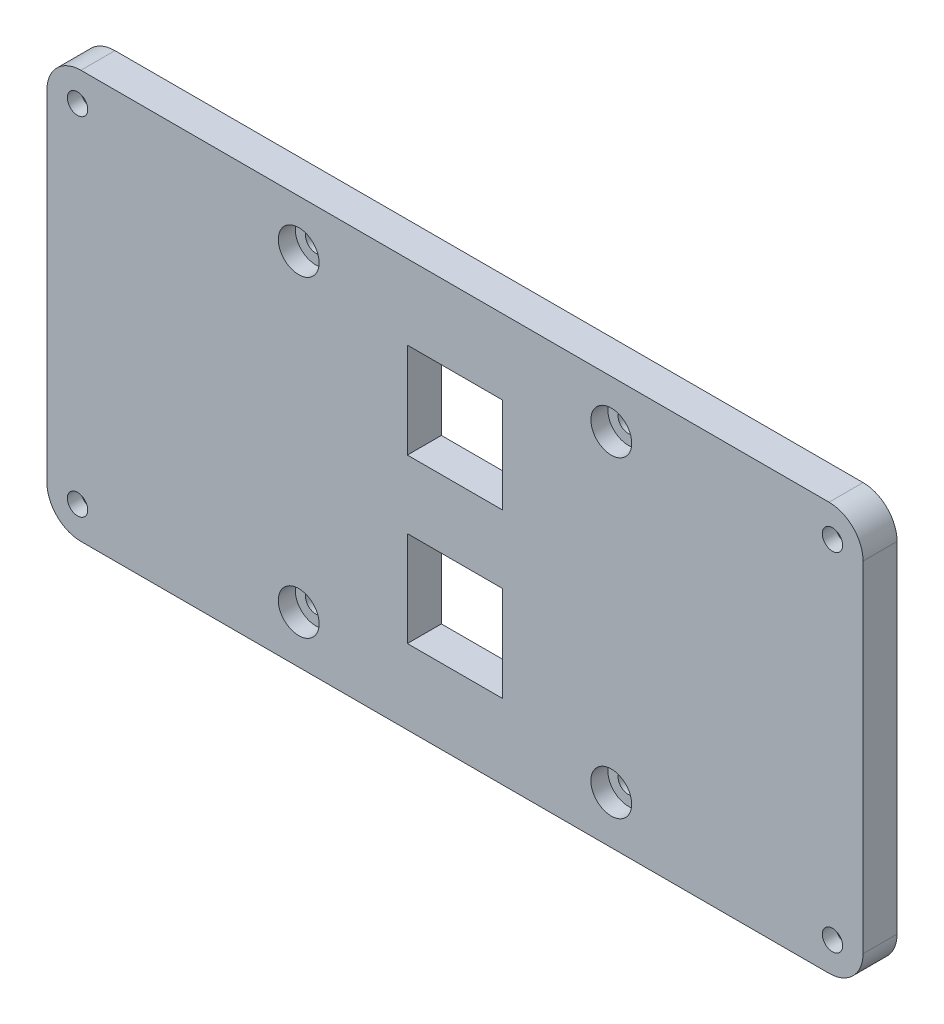
ISO-10303-21;
HEADER;
FILE_DESCRIPTION(('STEP AP214'),'2;1');
FILE_NAME('part.step','',(''),(''),'','','');
FILE_SCHEMA(('AUTOMOTIVE_DESIGN { 1 0 10303 214 1 1 1 1 }'));
ENDSEC;
DATA;
#1=APPLICATION_CONTEXT('core data for automotive mechanical design processes');
#2=APPLICATION_PROTOCOL_DEFINITION('international standard','automotive_design',2000,#1);
#3=PRODUCT_CONTEXT('',#1,'mechanical');
#4=PRODUCT('Part','Part','',(#3));
#5=PRODUCT_RELATED_PRODUCT_CATEGORY('part','',(#4));
#6=PRODUCT_DEFINITION_FORMATION('','',#4);
#7=PRODUCT_DEFINITION_CONTEXT('part definition',#1,'design');
#8=PRODUCT_DEFINITION('design','',#6,#7);
#9=PRODUCT_DEFINITION_SHAPE('','',#8);
#10=(LENGTH_UNIT() NAMED_UNIT(*) SI_UNIT(.MILLI.,.METRE.));
#11=(NAMED_UNIT(*) PLANE_ANGLE_UNIT() SI_UNIT($,.RADIAN.));
#12=(NAMED_UNIT(*) SI_UNIT($,.STERADIAN.) SOLID_ANGLE_UNIT());
#13=UNCERTAINTY_MEASURE_WITH_UNIT(LENGTH_MEASURE(1.E-05),#10,'distance_accuracy_value','');
#14=(GEOMETRIC_REPRESENTATION_CONTEXT(3) GLOBAL_UNCERTAINTY_ASSIGNED_CONTEXT((#13)) GLOBAL_UNIT_ASSIGNED_CONTEXT((#10,
#11,#12)) REPRESENTATION_CONTEXT('',''));
#15=CARTESIAN_POINT('',(0.,0.,0.));
#16=DIRECTION('',(0.,0.,1.));
#17=DIRECTION('',(1.,0.,0.));
#18=AXIS2_PLACEMENT_3D('',#15,#16,#17);
#19=CARTESIAN_POINT('',(0.,0.,0.));
#20=DIRECTION('',(0.,0.,1.));
#21=DIRECTION('',(1.,0.,0.));
#22=AXIS2_PLACEMENT_3D('',#19,#20,#21);
#23=PLANE('',#22);
#24=CARTESIAN_POINT('',(82.9809703885621,52.9809703885621,0.));
#25=DIRECTION('',(0.,0.,1.));
#26=DIRECTION('',(1.,0.,0.));
#27=AXIS2_PLACEMENT_3D('',#24,#25,#26);
#28=CIRCLE('',#27,1.50000000000023);
#29=CARTESIAN_POINT('',(84.4809703885623,52.9809703885621,0.));
#30=VERTEX_POINT('',#29);
#31=EDGE_CURVE('E157',#30,#30,#28,.T.);
#32=ORIENTED_EDGE('',*,*,#31,.T.);
#33=EDGE_LOOP('',(#32));
#34=FACE_BOUND('',#33,.T.);
#35=CARTESIAN_POINT('',(82.9809703885621,7.01902961143792,0.));
#36=DIRECTION('',(0.,0.,1.));
#37=DIRECTION('',(1.,0.,0.));
#38=AXIS2_PLACEMENT_3D('',#35,#36,#37);
#39=CIRCLE('',#38,1.49999999999849);
#40=CARTESIAN_POINT('',(84.4809703885606,7.01902961143792,0.));
#41=VERTEX_POINT('',#40);
#42=EDGE_CURVE('E205',#41,#41,#39,.T.);
#43=ORIENTED_EDGE('',*,*,#42,.T.);
#44=EDGE_LOOP('',(#43));
#45=FACE_BOUND('',#44,.T.);
#46=CARTESIAN_POINT('',(37.0190296114379,7.01902961143791,0.));
#47=DIRECTION('',(0.,0.,1.));
#48=DIRECTION('',(1.,0.,0.));
#49=AXIS2_PLACEMENT_3D('',#46,#47,#48);
#50=CIRCLE('',#49,1.49999999999803);
#51=CARTESIAN_POINT('',(38.5190296114359,7.01902961143791,0.));
#52=VERTEX_POINT('',#51);
#53=EDGE_CURVE('E211',#52,#52,#50,.T.);
#54=ORIENTED_EDGE('',*,*,#53,.T.);
#55=EDGE_LOOP('',(#54));
#56=FACE_BOUND('',#55,.T.);
#57=CARTESIAN_POINT('',(37.0190296114379,52.9809703885621,0.));
#58=DIRECTION('',(0.,0.,1.));
#59=DIRECTION('',(1.,0.,0.));
#60=AXIS2_PLACEMENT_3D('',#57,#58,#59);
#61=CIRCLE('',#60,1.49999999999999);
#62=CARTESIAN_POINT('',(38.5190296114379,52.9809703885621,0.));
#63=VERTEX_POINT('',#62);
#64=EDGE_CURVE('E220',#63,#63,#61,.T.);
#65=ORIENTED_EDGE('',*,*,#64,.T.);
#66=EDGE_LOOP('',(#65));
#67=FACE_BOUND('',#66,.T.);
#68=CARTESIAN_POINT('',(115.5,4.49999999999995,0.));
#69=DIRECTION('',(0.,0.,1.));
#70=DIRECTION('',(1.,0.,0.));
#71=AXIS2_PLACEMENT_3D('',#68,#69,#70);
#72=CIRCLE('',#71,3.00000000000001);
#73=CARTESIAN_POINT('',(118.5,4.49999999999995,0.));
#74=VERTEX_POINT('',#73);
#75=EDGE_CURVE('E254',#74,#74,#72,.T.);
#76=ORIENTED_EDGE('',*,*,#75,.T.);
#77=EDGE_LOOP('',(#76));
#78=FACE_BOUND('',#77,.T.);
#79=CARTESIAN_POINT('',(4.5,4.5,0.));
#80=DIRECTION('',(0.,0.,-1.));
#81=DIRECTION('',(-1.,0.,0.));
#82=AXIS2_PLACEMENT_3D('',#79,#80,#81);
#83=CIRCLE('',#82,3.);
#84=CARTESIAN_POINT('',(1.5,4.5,0.));
#85=VERTEX_POINT('',#84);
#86=EDGE_CURVE('E248',#85,#85,#83,.T.);
#87=ORIENTED_EDGE('',*,*,#86,.F.);
#88=EDGE_LOOP('',(#87));
#89=FACE_BOUND('',#88,.T.);
#90=DIRECTION('',(0.,1.,0.));
#91=VECTOR('',#90,1.);
#92=CARTESIAN_POINT('',(0.,0.,0.));
#93=LINE('',#92,#91);
#94=CARTESIAN_POINT('',(0.,5.,0.));
#95=VERTEX_POINT('',#94);
#96=CARTESIAN_POINT('',(0.,55.,0.));
#97=VERTEX_POINT('',#96);
#98=EDGE_CURVE('E283',#95,#97,#93,.T.);
#99=ORIENTED_EDGE('',*,*,#98,.T.);
#100=CARTESIAN_POINT('',(4.99999999999998,55.,0.));
#101=DIRECTION('',(0.,0.,1.));
#102=DIRECTION('',(1.,0.,0.));
#103=AXIS2_PLACEMENT_3D('',#100,#101,#102);
#104=CIRCLE('',#103,5.);
#105=CARTESIAN_POINT('',(4.99999999999998,60.,0.));
#106=VERTEX_POINT('',#105);
#107=EDGE_CURVE('E329',#97,#106,#104,.F.);
#108=ORIENTED_EDGE('',*,*,#107,.T.);
#109=DIRECTION('',(1.,0.,0.));
#110=VECTOR('',#109,1.);
#111=CARTESIAN_POINT('',(0.,60.,0.));
#112=LINE('',#111,#110);
#113=CARTESIAN_POINT('',(115.,60.,0.));
#114=VERTEX_POINT('',#113);
#115=EDGE_CURVE('E298',#106,#114,#112,.T.);
#116=ORIENTED_EDGE('',*,*,#115,.T.);
#117=CARTESIAN_POINT('',(115.,55.,0.));
#118=DIRECTION('',(0.,0.,1.));
#119=DIRECTION('',(1.,0.,0.));
#120=AXIS2_PLACEMENT_3D('',#117,#118,#119);
#121=CIRCLE('',#120,5.);
#122=CARTESIAN_POINT('',(120.,55.,0.));
#123=VERTEX_POINT('',#122);
#124=EDGE_CURVE('E323',#114,#123,#121,.F.);
#125=ORIENTED_EDGE('',*,*,#124,.T.);
#126=DIRECTION('',(0.,1.,0.));
#127=VECTOR('',#126,1.);
#128=CARTESIAN_POINT('',(120.,0.,0.));
#129=LINE('',#128,#127);
#130=CARTESIAN_POINT('',(120.,5.,0.));
#131=VERTEX_POINT('',#130);
#132=EDGE_CURVE('E295',#131,#123,#129,.T.);
#133=ORIENTED_EDGE('',*,*,#132,.F.);
#134=CARTESIAN_POINT('',(115.,5.,0.));
#135=DIRECTION('',(0.,0.,1.));
#136=DIRECTION('',(1.,0.,0.));
#137=AXIS2_PLACEMENT_3D('',#134,#135,#136);
#138=CIRCLE('',#137,5.);
#139=CARTESIAN_POINT('',(115.,0.,0.));
#140=VERTEX_POINT('',#139);
#141=EDGE_CURVE('E325',#131,#140,#138,.F.);
#142=ORIENTED_EDGE('',*,*,#141,.T.);
#143=DIRECTION('',(1.,0.,0.));
#144=VECTOR('',#143,1.);
#145=CARTESIAN_POINT('',(0.,0.,0.));
#146=LINE('',#145,#144);
#147=CARTESIAN_POINT('',(5.,0.,0.));
#148=VERTEX_POINT('',#147);
#149=EDGE_CURVE('E278',#148,#140,#146,.T.);
#150=ORIENTED_EDGE('',*,*,#149,.F.);
#151=CARTESIAN_POINT('',(5.,5.,0.));
#152=DIRECTION('',(0.,0.,1.));
#153=DIRECTION('',(1.,0.,0.));
#154=AXIS2_PLACEMENT_3D('',#151,#152,#153);
#155=CIRCLE('',#154,5.);
#156=EDGE_CURVE('E327',#148,#95,#155,.F.);
#157=ORIENTED_EDGE('',*,*,#156,.T.);
#158=EDGE_LOOP('',(#99,#108,#116,#125,#133,#142,#150,#157));
#159=FACE_BOUND('',#158,.T.);
#160=CARTESIAN_POINT('',(115.5,55.5,0.));
#161=DIRECTION('',(0.,0.,-1.));
#162=DIRECTION('',(-1.,0.,0.));
#163=AXIS2_PLACEMENT_3D('',#160,#161,#162);
#164=CIRCLE('',#163,3.00000000000001);
#165=CARTESIAN_POINT('',(112.5,55.5,0.));
#166=VERTEX_POINT('',#165);
#167=EDGE_CURVE('E244',#166,#166,#164,.T.);
#168=ORIENTED_EDGE('',*,*,#167,.F.);
#169=EDGE_LOOP('',(#168));
#170=FACE_BOUND('',#169,.T.);
#171=CARTESIAN_POINT('',(4.5,55.5,0.));
#172=DIRECTION('',(0.,0.,1.));
#173=DIRECTION('',(1.,0.,0.));
#174=AXIS2_PLACEMENT_3D('',#171,#172,#173);
#175=CIRCLE('',#174,3.);
#176=CARTESIAN_POINT('',(7.5,55.5,0.));
#177=VERTEX_POINT('',#176);
#178=EDGE_CURVE('E241',#177,#177,#175,.T.);
#179=ORIENTED_EDGE('',*,*,#178,.T.);
#180=EDGE_LOOP('',(#179));
#181=FACE_BOUND('',#180,.T.);
#182=DIRECTION('',(0.,-1.,0.));
#183=VECTOR('',#182,1.);
#184=CARTESIAN_POINT('',(67.,25.,0.));
#185=LINE('',#184,#183);
#186=CARTESIAN_POINT('',(67.,25.,0.));
#187=VERTEX_POINT('',#186);
#188=CARTESIAN_POINT('',(67.,11.,0.));
#189=VERTEX_POINT('',#188);
#190=EDGE_CURVE('E173',#187,#189,#185,.T.);
#191=ORIENTED_EDGE('',*,*,#190,.F.);
#192=DIRECTION('',(1.,0.,0.));
#193=VECTOR('',#192,1.);
#194=CARTESIAN_POINT('',(53.,25.,0.));
#195=LINE('',#194,#193);
#196=CARTESIAN_POINT('',(53.,25.,0.));
#197=VERTEX_POINT('',#196);
#198=EDGE_CURVE('E62',#197,#187,#195,.T.);
#199=ORIENTED_EDGE('',*,*,#198,.F.);
#200=DIRECTION('',(0.,-1.,0.));
#201=VECTOR('',#200,1.);
#202=CARTESIAN_POINT('',(53.,25.,0.));
#203=LINE('',#202,#201);
#204=CARTESIAN_POINT('',(53.,11.,0.));
#205=VERTEX_POINT('',#204);
#206=EDGE_CURVE('E185',#197,#205,#203,.T.);
#207=ORIENTED_EDGE('',*,*,#206,.T.);
#208=DIRECTION('',(1.,0.,0.));
#209=VECTOR('',#208,1.);
#210=CARTESIAN_POINT('',(53.,11.,0.));
#211=LINE('',#210,#209);
#212=EDGE_CURVE('E194',#205,#189,#211,.T.);
#213=ORIENTED_EDGE('',*,*,#212,.T.);
#214=EDGE_LOOP('',(#191,#199,#207,#213));
#215=FACE_BOUND('',#214,.T.);
#216=DIRECTION('',(1.,0.,0.));
#217=VECTOR('',#216,1.);
#218=CARTESIAN_POINT('',(53.,35.,0.));
#219=LINE('',#218,#217);
#220=CARTESIAN_POINT('',(53.,35.,0.));
#221=VERTEX_POINT('',#220);
#222=CARTESIAN_POINT('',(67.,35.,0.));
#223=VERTEX_POINT('',#222);
#224=EDGE_CURVE('E54',#221,#223,#219,.T.);
#225=ORIENTED_EDGE('',*,*,#224,.T.);
#226=DIRECTION('',(0.,1.,0.));
#227=VECTOR('',#226,1.);
#228=CARTESIAN_POINT('',(67.,35.,0.));
#229=LINE('',#228,#227);
#230=CARTESIAN_POINT('',(67.,49.,0.));
#231=VERTEX_POINT('',#230);
#232=EDGE_CURVE('E161',#223,#231,#229,.T.);
#233=ORIENTED_EDGE('',*,*,#232,.T.);
#234=DIRECTION('',(1.,0.,0.));
#235=VECTOR('',#234,1.);
#236=CARTESIAN_POINT('',(53.,49.,0.));
#237=LINE('',#236,#235);
#238=CARTESIAN_POINT('',(53.,49.,0.));
#239=VERTEX_POINT('',#238);
#240=EDGE_CURVE('E167',#239,#231,#237,.T.);
#241=ORIENTED_EDGE('',*,*,#240,.F.);
#242=DIRECTION('',(0.,1.,0.));
#243=VECTOR('',#242,1.);
#244=CARTESIAN_POINT('',(53.,35.,0.));
#245=LINE('',#244,#243);
#246=EDGE_CURVE('E171',#221,#239,#245,.T.);
#247=ORIENTED_EDGE('',*,*,#246,.F.);
#248=EDGE_LOOP('',(#225,#233,#241,#247));
#249=FACE_BOUND('',#248,.T.);
#250=ADVANCED_FACE('F39',(#34,#45,#56,#67,#78,#89,#159,#170,#181,#215,#249),#23,.F.);
#251=CARTESIAN_POINT('',(0.,0.,5.));
#252=DIRECTION('',(0.,0.,1.));
#253=DIRECTION('',(1.,0.,0.));
#254=AXIS2_PLACEMENT_3D('',#251,#252,#253);
#255=PLANE('',#254);
#256=DIRECTION('',(-1.,0.,0.));
#257=VECTOR('',#256,1.);
#258=CARTESIAN_POINT('',(0.,25.,5.));
#259=LINE('',#258,#257);
#260=CARTESIAN_POINT('',(67.,25.,5.));
#261=VERTEX_POINT('',#260);
#262=CARTESIAN_POINT('',(53.,25.,5.));
#263=VERTEX_POINT('',#262);
#264=EDGE_CURVE('E362',#261,#263,#259,.T.);
#265=ORIENTED_EDGE('',*,*,#264,.F.);
#266=DIRECTION('',(0.,1.,0.));
#267=VECTOR('',#266,1.);
#268=CARTESIAN_POINT('',(67.,0.,5.));
#269=LINE('',#268,#267);
#270=CARTESIAN_POINT('',(67.,11.,5.));
#271=VERTEX_POINT('',#270);
#272=EDGE_CURVE('E354',#271,#261,#269,.T.);
#273=ORIENTED_EDGE('',*,*,#272,.F.);
#274=DIRECTION('',(-1.,0.,0.));
#275=VECTOR('',#274,1.);
#276=CARTESIAN_POINT('',(0.,11.,5.));
#277=LINE('',#276,#275);
#278=CARTESIAN_POINT('',(53.,11.,5.));
#279=VERTEX_POINT('',#278);
#280=EDGE_CURVE('E356',#271,#279,#277,.T.);
#281=ORIENTED_EDGE('',*,*,#280,.T.);
#282=DIRECTION('',(0.,1.,0.));
#283=VECTOR('',#282,1.);
#284=CARTESIAN_POINT('',(53.,0.,5.));
#285=LINE('',#284,#283);
#286=EDGE_CURVE('E359',#279,#263,#285,.T.);
#287=ORIENTED_EDGE('',*,*,#286,.T.);
#288=EDGE_LOOP('',(#265,#273,#281,#287));
#289=FACE_BOUND('',#288,.T.);
#290=CARTESIAN_POINT('',(82.9809703885621,7.01902961143792,5.));
#291=DIRECTION('',(0.,0.,1.));
#292=DIRECTION('',(1.,0.,0.));
#293=AXIS2_PLACEMENT_3D('',#290,#291,#292);
#294=CIRCLE('',#293,3.00000000000003);
#295=CARTESIAN_POINT('',(85.9809703885621,7.01902961143792,5.));
#296=VERTEX_POINT('',#295);
#297=EDGE_CURVE('E233',#296,#296,#294,.T.);
#298=ORIENTED_EDGE('',*,*,#297,.F.);
#299=EDGE_LOOP('',(#298));
#300=FACE_BOUND('',#299,.T.);
#301=CARTESIAN_POINT('',(37.0190296114379,52.9809703885621,5.));
#302=DIRECTION('',(0.,0.,1.));
#303=DIRECTION('',(1.,0.,0.));
#304=AXIS2_PLACEMENT_3D('',#301,#302,#303);
#305=CIRCLE('',#304,3.);
#306=CARTESIAN_POINT('',(40.0190296114379,52.9809703885621,5.));
#307=VERTEX_POINT('',#306);
#308=EDGE_CURVE('E232',#307,#307,#305,.T.);
#309=ORIENTED_EDGE('',*,*,#308,.F.);
#310=EDGE_LOOP('',(#309));
#311=FACE_BOUND('',#310,.T.);
#312=CARTESIAN_POINT('',(115.5,4.49999999999995,5.));
#313=DIRECTION('',(0.,0.,1.));
#314=DIRECTION('',(1.,0.,0.));
#315=AXIS2_PLACEMENT_3D('',#312,#313,#314);
#316=CIRCLE('',#315,1.50000000000001);
#317=CARTESIAN_POINT('',(117.,4.49999999999995,5.));
#318=VERTEX_POINT('',#317);
#319=EDGE_CURVE('E269',#318,#318,#316,.T.);
#320=ORIENTED_EDGE('',*,*,#319,.F.);
#321=EDGE_LOOP('',(#320));
#322=FACE_BOUND('',#321,.T.);
#323=CARTESIAN_POINT('',(4.5,55.5,5.));
#324=DIRECTION('',(0.,0.,1.));
#325=DIRECTION('',(1.,0.,0.));
#326=AXIS2_PLACEMENT_3D('',#323,#324,#325);
#327=CIRCLE('',#326,1.5);
#328=CARTESIAN_POINT('',(6.,55.5,5.));
#329=VERTEX_POINT('',#328);
#330=EDGE_CURVE('E268',#329,#329,#327,.T.);
#331=ORIENTED_EDGE('',*,*,#330,.F.);
#332=EDGE_LOOP('',(#331));
#333=FACE_BOUND('',#332,.T.);
#334=DIRECTION('',(1.,0.,0.));
#335=VECTOR('',#334,1.);
#336=CARTESIAN_POINT('',(0.,60.,5.));
#337=LINE('',#336,#335);
#338=CARTESIAN_POINT('',(4.99999999999998,60.,5.));
#339=VERTEX_POINT('',#338);
#340=CARTESIAN_POINT('',(115.,60.,5.));
#341=VERTEX_POINT('',#340);
#342=EDGE_CURVE('E286',#339,#341,#337,.T.);
#343=ORIENTED_EDGE('',*,*,#342,.F.);
#344=CARTESIAN_POINT('',(4.99999999999998,55.,5.));
#345=DIRECTION('',(0.,0.,1.));
#346=DIRECTION('',(1.,0.,0.));
#347=AXIS2_PLACEMENT_3D('',#344,#345,#346);
#348=CIRCLE('',#347,5.);
#349=CARTESIAN_POINT('',(0.,55.,5.));
#350=VERTEX_POINT('',#349);
#351=EDGE_CURVE('E342',#339,#350,#348,.T.);
#352=ORIENTED_EDGE('',*,*,#351,.T.);
#353=DIRECTION('',(0.,1.,0.));
#354=VECTOR('',#353,1.);
#355=CARTESIAN_POINT('',(0.,0.,5.));
#356=LINE('',#355,#354);
#357=CARTESIAN_POINT('',(0.,5.,5.));
#358=VERTEX_POINT('',#357);
#359=EDGE_CURVE('E289',#358,#350,#356,.T.);
#360=ORIENTED_EDGE('',*,*,#359,.F.);
#361=CARTESIAN_POINT('',(5.,5.,5.));
#362=DIRECTION('',(0.,0.,1.));
#363=DIRECTION('',(1.,0.,0.));
#364=AXIS2_PLACEMENT_3D('',#361,#362,#363);
#365=CIRCLE('',#364,5.);
#366=CARTESIAN_POINT('',(5.,0.,5.));
#367=VERTEX_POINT('',#366);
#368=EDGE_CURVE('E340',#358,#367,#365,.T.);
#369=ORIENTED_EDGE('',*,*,#368,.T.);
#370=DIRECTION('',(1.,0.,0.));
#371=VECTOR('',#370,1.);
#372=CARTESIAN_POINT('',(0.,0.,5.));
#373=LINE('',#372,#371);
#374=CARTESIAN_POINT('',(115.,0.,5.));
#375=VERTEX_POINT('',#374);
#376=EDGE_CURVE('E279',#367,#375,#373,.T.);
#377=ORIENTED_EDGE('',*,*,#376,.T.);
#378=CARTESIAN_POINT('',(115.,5.,5.));
#379=DIRECTION('',(0.,0.,1.));
#380=DIRECTION('',(1.,0.,0.));
#381=AXIS2_PLACEMENT_3D('',#378,#379,#380);
#382=CIRCLE('',#381,5.);
#383=CARTESIAN_POINT('',(120.,5.,5.));
#384=VERTEX_POINT('',#383);
#385=EDGE_CURVE('E338',#375,#384,#382,.T.);
#386=ORIENTED_EDGE('',*,*,#385,.T.);
#387=DIRECTION('',(0.,1.,0.));
#388=VECTOR('',#387,1.);
#389=CARTESIAN_POINT('',(120.,0.,5.));
#390=LINE('',#389,#388);
#391=CARTESIAN_POINT('',(120.,55.,5.));
#392=VERTEX_POINT('',#391);
#393=EDGE_CURVE('E282',#384,#392,#390,.T.);
#394=ORIENTED_EDGE('',*,*,#393,.T.);
#395=CARTESIAN_POINT('',(115.,55.,5.));
#396=DIRECTION('',(0.,0.,1.));
#397=DIRECTION('',(1.,0.,0.));
#398=AXIS2_PLACEMENT_3D('',#395,#396,#397);
#399=CIRCLE('',#398,5.);
#400=EDGE_CURVE('E336',#392,#341,#399,.T.);
#401=ORIENTED_EDGE('',*,*,#400,.T.);
#402=EDGE_LOOP('',(#343,#352,#360,#369,#377,#386,#394,#401));
#403=FACE_BOUND('',#402,.T.);
#404=CARTESIAN_POINT('',(4.5,4.5,5.));
#405=DIRECTION('',(0.,0.,1.));
#406=DIRECTION('',(1.,0.,0.));
#407=AXIS2_PLACEMENT_3D('',#404,#405,#406);
#408=CIRCLE('',#407,1.5);
#409=CARTESIAN_POINT('',(6.,4.5,5.));
#410=VERTEX_POINT('',#409);
#411=EDGE_CURVE('E265',#410,#410,#408,.F.);
#412=ORIENTED_EDGE('',*,*,#411,.T.);
#413=EDGE_LOOP('',(#412));
#414=FACE_BOUND('',#413,.T.);
#415=CARTESIAN_POINT('',(115.5,55.5,5.));
#416=DIRECTION('',(0.,0.,1.));
#417=DIRECTION('',(1.,0.,0.));
#418=AXIS2_PLACEMENT_3D('',#415,#416,#417);
#419=CIRCLE('',#418,1.50000000000001);
#420=CARTESIAN_POINT('',(117.,55.5,5.));
#421=VERTEX_POINT('',#420);
#422=EDGE_CURVE('E272',#421,#421,#419,.F.);
#423=ORIENTED_EDGE('',*,*,#422,.T.);
#424=EDGE_LOOP('',(#423));
#425=FACE_BOUND('',#424,.T.);
#426=CARTESIAN_POINT('',(82.9809703885621,52.9809703885621,5.));
#427=DIRECTION('',(0.,0.,-1.));
#428=DIRECTION('',(-1.,0.,0.));
#429=AXIS2_PLACEMENT_3D('',#426,#427,#428);
#430=CIRCLE('',#429,3.00000000000003);
#431=CARTESIAN_POINT('',(79.9809703885621,52.9809703885621,5.));
#432=VERTEX_POINT('',#431);
#433=EDGE_CURVE('E229',#432,#432,#430,.T.);
#434=ORIENTED_EDGE('',*,*,#433,.T.);
#435=EDGE_LOOP('',(#434));
#436=FACE_BOUND('',#435,.T.);
#437=CARTESIAN_POINT('',(37.0190296114379,7.01902961143791,5.));
#438=DIRECTION('',(0.,0.,-1.));
#439=DIRECTION('',(-1.,0.,0.));
#440=AXIS2_PLACEMENT_3D('',#437,#438,#439);
#441=CIRCLE('',#440,2.99999999999999);
#442=CARTESIAN_POINT('',(34.0190296114379,7.01902961143791,5.));
#443=VERTEX_POINT('',#442);
#444=EDGE_CURVE('E226',#443,#443,#441,.T.);
#445=ORIENTED_EDGE('',*,*,#444,.T.);
#446=EDGE_LOOP('',(#445));
#447=FACE_BOUND('',#446,.T.);
#448=DIRECTION('',(0.,-1.,0.));
#449=VECTOR('',#448,1.);
#450=CARTESIAN_POINT('',(67.,0.,5.));
#451=LINE('',#450,#449);
#452=CARTESIAN_POINT('',(67.,49.,5.));
#453=VERTEX_POINT('',#452);
#454=CARTESIAN_POINT('',(67.,35.,5.));
#455=VERTEX_POINT('',#454);
#456=EDGE_CURVE('E47',#453,#455,#451,.T.);
#457=ORIENTED_EDGE('',*,*,#456,.T.);
#458=DIRECTION('',(-1.,0.,0.));
#459=VECTOR('',#458,1.);
#460=CARTESIAN_POINT('',(0.,35.,5.));
#461=LINE('',#460,#459);
#462=CARTESIAN_POINT('',(53.,35.,5.));
#463=VERTEX_POINT('',#462);
#464=EDGE_CURVE('E11',#455,#463,#461,.T.);
#465=ORIENTED_EDGE('',*,*,#464,.T.);
#466=DIRECTION('',(0.,-1.,0.));
#467=VECTOR('',#466,1.);
#468=CARTESIAN_POINT('',(53.,0.,5.));
#469=LINE('',#468,#467);
#470=CARTESIAN_POINT('',(53.,49.,5.));
#471=VERTEX_POINT('',#470);
#472=EDGE_CURVE('E364',#471,#463,#469,.T.);
#473=ORIENTED_EDGE('',*,*,#472,.F.);
#474=DIRECTION('',(-1.,0.,0.));
#475=VECTOR('',#474,1.);
#476=CARTESIAN_POINT('',(0.,49.,5.));
#477=LINE('',#476,#475);
#478=EDGE_CURVE('E366',#453,#471,#477,.T.);
#479=ORIENTED_EDGE('',*,*,#478,.F.);
#480=EDGE_LOOP('',(#457,#465,#473,#479));
#481=FACE_BOUND('',#480,.T.);
#482=ADVANCED_FACE('F370',(#289,#300,#311,#322,#333,#403,#414,#425,#436,#447,#481),#255,.T.);
#483=CARTESIAN_POINT('',(4.5,4.5,5.));
#484=DIRECTION('',(0.,0.,-1.));
#485=DIRECTION('',(-1.,0.,0.));
#486=AXIS2_PLACEMENT_3D('',#483,#484,#485);
#487=CYLINDRICAL_SURFACE('',#486,1.5);
#488=ORIENTED_EDGE('',*,*,#411,.F.);
#489=EDGE_LOOP('',(#488));
#490=FACE_BOUND('',#489,.T.);
#491=CARTESIAN_POINT('',(4.5,4.5,3.));
#492=DIRECTION('',(0.,0.,-1.));
#493=DIRECTION('',(-1.,0.,0.));
#494=AXIS2_PLACEMENT_3D('',#491,#492,#493);
#495=CIRCLE('',#494,1.5);
#496=CARTESIAN_POINT('',(3.,4.5,3.));
#497=VERTEX_POINT('',#496);
#498=EDGE_CURVE('E308',#497,#497,#495,.F.);
#499=ORIENTED_EDGE('',*,*,#498,.F.);
#500=EDGE_LOOP('',(#499));
#501=FACE_BOUND('',#500,.T.);
#502=ADVANCED_FACE('F388',(#490,#501),#487,.F.);
#503=CARTESIAN_POINT('',(115.5,55.5,5.));
#504=DIRECTION('',(0.,0.,-1.));
#505=DIRECTION('',(-1.,0.,0.));
#506=AXIS2_PLACEMENT_3D('',#503,#504,#505);
#507=CYLINDRICAL_SURFACE('',#506,1.50000000000001);
#508=ORIENTED_EDGE('',*,*,#422,.F.);
#509=EDGE_LOOP('',(#508));
#510=FACE_BOUND('',#509,.T.);
#511=CARTESIAN_POINT('',(115.5,55.5,3.));
#512=DIRECTION('',(0.,0.,-1.));
#513=DIRECTION('',(-1.,0.,0.));
#514=AXIS2_PLACEMENT_3D('',#511,#512,#513);
#515=CIRCLE('',#514,1.50000000000001);
#516=CARTESIAN_POINT('',(114.,55.5,3.));
#517=VERTEX_POINT('',#516);
#518=EDGE_CURVE('E262',#517,#517,#515,.F.);
#519=ORIENTED_EDGE('',*,*,#518,.F.);
#520=EDGE_LOOP('',(#519));
#521=FACE_BOUND('',#520,.T.);
#522=ADVANCED_FACE('F410',(#510,#521),#507,.F.);
#523=CARTESIAN_POINT('',(0.,0.,5.));
#524=DIRECTION('',(0.,1.,0.));
#525=DIRECTION('',(0.,0.,1.));
#526=AXIS2_PLACEMENT_3D('',#523,#524,#525);
#527=PLANE('',#526);
#528=ORIENTED_EDGE('',*,*,#376,.F.);
#529=DIRECTION('',(0.,0.,-1.));
#530=VECTOR('',#529,1.);
#531=CARTESIAN_POINT('',(5.,0.,0.));
#532=LINE('',#531,#530);
#533=EDGE_CURVE('E346',#367,#148,#532,.T.);
#534=ORIENTED_EDGE('',*,*,#533,.T.);
#535=ORIENTED_EDGE('',*,*,#149,.T.);
#536=DIRECTION('',(0.,0.,-1.));
#537=VECTOR('',#536,1.);
#538=CARTESIAN_POINT('',(115.,0.,5.));
#539=LINE('',#538,#537);
#540=EDGE_CURVE('E344',#140,#375,#539,.F.);
#541=ORIENTED_EDGE('',*,*,#540,.T.);
#542=EDGE_LOOP('',(#528,#534,#535,#541));
#543=FACE_BOUND('',#542,.T.);
#544=ADVANCED_FACE('F406',(#543),#527,.F.);
#545=CARTESIAN_POINT('',(120.,0.,5.));
#546=DIRECTION('',(-1.,0.,0.));
#547=DIRECTION('',(0.,-1.,0.));
#548=AXIS2_PLACEMENT_3D('',#545,#546,#547);
#549=PLANE('',#548);
#550=ORIENTED_EDGE('',*,*,#393,.F.);
#551=DIRECTION('',(0.,0.,-1.));
#552=VECTOR('',#551,1.);
#553=CARTESIAN_POINT('',(120.,5.,5.));
#554=LINE('',#553,#552);
#555=EDGE_CURVE('E351',#384,#131,#554,.T.);
#556=ORIENTED_EDGE('',*,*,#555,.T.);
#557=ORIENTED_EDGE('',*,*,#132,.T.);
#558=DIRECTION('',(0.,0.,-1.));
#559=VECTOR('',#558,1.);
#560=CARTESIAN_POINT('',(120.,55.,5.));
#561=LINE('',#560,#559);
#562=EDGE_CURVE('E349',#123,#392,#561,.F.);
#563=ORIENTED_EDGE('',*,*,#562,.T.);
#564=EDGE_LOOP('',(#550,#556,#557,#563));
#565=FACE_BOUND('',#564,.T.);
#566=ADVANCED_FACE('F402',(#565),#549,.F.);
#567=CARTESIAN_POINT('',(0.,60.,5.));
#568=DIRECTION('',(0.,1.,0.));
#569=DIRECTION('',(0.,0.,1.));
#570=AXIS2_PLACEMENT_3D('',#567,#568,#569);
#571=PLANE('',#570);
#572=ORIENTED_EDGE('',*,*,#115,.F.);
#573=DIRECTION('',(0.,0.,-1.));
#574=VECTOR('',#573,1.);
#575=CARTESIAN_POINT('',(4.99999999999998,60.,5.));
#576=LINE('',#575,#574);
#577=EDGE_CURVE('E334',#106,#339,#576,.F.);
#578=ORIENTED_EDGE('',*,*,#577,.T.);
#579=ORIENTED_EDGE('',*,*,#342,.T.);
#580=DIRECTION('',(0.,0.,-1.));
#581=VECTOR('',#580,1.);
#582=CARTESIAN_POINT('',(115.,60.,0.));
#583=LINE('',#582,#581);
#584=EDGE_CURVE('E331',#341,#114,#583,.T.);
#585=ORIENTED_EDGE('',*,*,#584,.T.);
#586=EDGE_LOOP('',(#572,#578,#579,#585));
#587=FACE_BOUND('',#586,.T.);
#588=ADVANCED_FACE('F398',(#587),#571,.T.);
#589=CARTESIAN_POINT('',(0.,0.,5.));
#590=DIRECTION('',(-1.,0.,0.));
#591=DIRECTION('',(0.,-1.,0.));
#592=AXIS2_PLACEMENT_3D('',#589,#590,#591);
#593=PLANE('',#592);
#594=ORIENTED_EDGE('',*,*,#359,.T.);
#595=DIRECTION('',(0.,0.,-1.));
#596=VECTOR('',#595,1.);
#597=CARTESIAN_POINT('',(0.,55.,5.));
#598=LINE('',#597,#596);
#599=EDGE_CURVE('E320',#350,#97,#598,.T.);
#600=ORIENTED_EDGE('',*,*,#599,.T.);
#601=ORIENTED_EDGE('',*,*,#98,.F.);
#602=DIRECTION('',(0.,0.,-1.));
#603=VECTOR('',#602,1.);
#604=CARTESIAN_POINT('',(0.,5.,5.));
#605=LINE('',#604,#603);
#606=EDGE_CURVE('E318',#95,#358,#605,.F.);
#607=ORIENTED_EDGE('',*,*,#606,.T.);
#608=EDGE_LOOP('',(#594,#600,#601,#607));
#609=FACE_BOUND('',#608,.T.);
#610=ADVANCED_FACE('F394',(#609),#593,.T.);
#611=CARTESIAN_POINT('',(4.5,55.5,5.));
#612=DIRECTION('',(0.,0.,-1.));
#613=DIRECTION('',(-1.,0.,0.));
#614=AXIS2_PLACEMENT_3D('',#611,#612,#613);
#615=CYLINDRICAL_SURFACE('',#614,1.5);
#616=CARTESIAN_POINT('',(4.5,55.5,3.));
#617=DIRECTION('',(0.,0.,1.));
#618=DIRECTION('',(1.,0.,0.));
#619=AXIS2_PLACEMENT_3D('',#616,#617,#618);
#620=CIRCLE('',#619,1.5);
#621=CARTESIAN_POINT('',(6.,55.5,3.));
#622=VERTEX_POINT('',#621);
#623=EDGE_CURVE('E275',#622,#622,#620,.T.);
#624=ORIENTED_EDGE('',*,*,#623,.F.);
#625=EDGE_LOOP('',(#624));
#626=FACE_BOUND('',#625,.T.);
#627=ORIENTED_EDGE('',*,*,#330,.T.);
#628=EDGE_LOOP('',(#627));
#629=FACE_BOUND('',#628,.T.);
#630=ADVANCED_FACE('F397',(#626,#629),#615,.F.);
#631=CARTESIAN_POINT('',(115.5,4.49999999999995,5.));
#632=DIRECTION('',(0.,0.,-1.));
#633=DIRECTION('',(-1.,0.,0.));
#634=AXIS2_PLACEMENT_3D('',#631,#632,#633);
#635=CYLINDRICAL_SURFACE('',#634,1.50000000000001);
#636=CARTESIAN_POINT('',(115.5,4.49999999999995,3.));
#637=DIRECTION('',(0.,0.,1.));
#638=DIRECTION('',(1.,0.,0.));
#639=AXIS2_PLACEMENT_3D('',#636,#637,#638);
#640=CIRCLE('',#639,1.50000000000001);
#641=CARTESIAN_POINT('',(117.,4.49999999999995,3.));
#642=VERTEX_POINT('',#641);
#643=EDGE_CURVE('E305',#642,#642,#640,.T.);
#644=ORIENTED_EDGE('',*,*,#643,.F.);
#645=EDGE_LOOP('',(#644));
#646=FACE_BOUND('',#645,.T.);
#647=ORIENTED_EDGE('',*,*,#319,.T.);
#648=EDGE_LOOP('',(#647));
#649=FACE_BOUND('',#648,.T.);
#650=ADVANCED_FACE('F556',(#646,#649),#635,.F.);
#651=CARTESIAN_POINT('',(115.5,55.5,3.));
#652=DIRECTION('',(0.,0.,-1.));
#653=DIRECTION('',(-1.,0.,0.));
#654=AXIS2_PLACEMENT_3D('',#651,#652,#653);
#655=PLANE('',#654);
#656=CARTESIAN_POINT('',(115.5,55.5,3.));
#657=DIRECTION('',(0.,0.,-1.));
#658=DIRECTION('',(-1.,0.,0.));
#659=AXIS2_PLACEMENT_3D('',#656,#657,#658);
#660=CIRCLE('',#659,3.00000000000001);
#661=CARTESIAN_POINT('',(112.5,55.5,3.));
#662=VERTEX_POINT('',#661);
#663=EDGE_CURVE('E259',#662,#662,#660,.T.);
#664=ORIENTED_EDGE('',*,*,#663,.T.);
#665=EDGE_LOOP('',(#664));
#666=FACE_BOUND('',#665,.T.);
#667=ORIENTED_EDGE('',*,*,#518,.T.);
#668=EDGE_LOOP('',(#667));
#669=FACE_BOUND('',#668,.T.);
#670=ADVANCED_FACE('F553',(#666,#669),#655,.T.);
#671=CARTESIAN_POINT('',(115.5,55.5,3.));
#672=DIRECTION('',(0.,0.,-1.));
#673=DIRECTION('',(-1.,0.,0.));
#674=AXIS2_PLACEMENT_3D('',#671,#672,#673);
#675=CYLINDRICAL_SURFACE('',#674,3.00000000000001);
#676=ORIENTED_EDGE('',*,*,#663,.F.);
#677=EDGE_LOOP('',(#676));
#678=FACE_BOUND('',#677,.T.);
#679=ORIENTED_EDGE('',*,*,#167,.T.);
#680=EDGE_LOOP('',(#679));
#681=FACE_BOUND('',#680,.T.);
#682=ADVANCED_FACE('F548',(#678,#681),#675,.F.);
#683=CARTESIAN_POINT('',(115.5,4.49999999999995,3.));
#684=DIRECTION('',(0.,0.,-1.));
#685=DIRECTION('',(-1.,0.,0.));
#686=AXIS2_PLACEMENT_3D('',#683,#684,#685);
#687=CYLINDRICAL_SURFACE('',#686,3.00000000000001);
#688=CARTESIAN_POINT('',(115.5,4.49999999999995,3.));
#689=DIRECTION('',(0.,0.,1.));
#690=DIRECTION('',(1.,0.,0.));
#691=AXIS2_PLACEMENT_3D('',#688,#689,#690);
#692=CIRCLE('',#691,3.00000000000001);
#693=CARTESIAN_POINT('',(118.5,4.49999999999995,3.));
#694=VERTEX_POINT('',#693);
#695=EDGE_CURVE('E240',#694,#694,#692,.T.);
#696=ORIENTED_EDGE('',*,*,#695,.T.);
#697=EDGE_LOOP('',(#696));
#698=FACE_BOUND('',#697,.T.);
#699=ORIENTED_EDGE('',*,*,#75,.F.);
#700=EDGE_LOOP('',(#699));
#701=FACE_BOUND('',#700,.T.);
#702=ADVANCED_FACE('F545',(#698,#701),#687,.F.);
#703=CARTESIAN_POINT('',(115.5,4.49999999999995,3.));
#704=DIRECTION('',(0.,0.,1.));
#705=DIRECTION('',(1.,0.,0.));
#706=AXIS2_PLACEMENT_3D('',#703,#704,#705);
#707=PLANE('',#706);
#708=ORIENTED_EDGE('',*,*,#643,.T.);
#709=EDGE_LOOP('',(#708));
#710=FACE_BOUND('',#709,.T.);
#711=ORIENTED_EDGE('',*,*,#695,.F.);
#712=EDGE_LOOP('',(#711));
#713=FACE_BOUND('',#712,.T.);
#714=ADVANCED_FACE('F543',(#710,#713),#707,.F.);
#715=CARTESIAN_POINT('',(4.5,4.5,3.));
#716=DIRECTION('',(0.,0.,-1.));
#717=DIRECTION('',(-1.,0.,0.));
#718=AXIS2_PLACEMENT_3D('',#715,#716,#717);
#719=PLANE('',#718);
#720=CARTESIAN_POINT('',(4.5,4.5,3.));
#721=DIRECTION('',(0.,0.,-1.));
#722=DIRECTION('',(-1.,0.,0.));
#723=AXIS2_PLACEMENT_3D('',#720,#721,#722);
#724=CIRCLE('',#723,3.);
#725=CARTESIAN_POINT('',(1.5,4.5,3.));
#726=VERTEX_POINT('',#725);
#727=EDGE_CURVE('E251',#726,#726,#724,.T.);
#728=ORIENTED_EDGE('',*,*,#727,.T.);
#729=EDGE_LOOP('',(#728));
#730=FACE_BOUND('',#729,.T.);
#731=ORIENTED_EDGE('',*,*,#498,.T.);
#732=EDGE_LOOP('',(#731));
#733=FACE_BOUND('',#732,.T.);
#734=ADVANCED_FACE('F539',(#730,#733),#719,.T.);
#735=CARTESIAN_POINT('',(4.5,4.5,3.));
#736=DIRECTION('',(0.,0.,-1.));
#737=DIRECTION('',(-1.,0.,0.));
#738=AXIS2_PLACEMENT_3D('',#735,#736,#737);
#739=CYLINDRICAL_SURFACE('',#738,3.);
#740=ORIENTED_EDGE('',*,*,#727,.F.);
#741=EDGE_LOOP('',(#740));
#742=FACE_BOUND('',#741,.T.);
#743=ORIENTED_EDGE('',*,*,#86,.T.);
#744=EDGE_LOOP('',(#743));
#745=FACE_BOUND('',#744,.T.);
#746=ADVANCED_FACE('F532',(#742,#745),#739,.F.);
#747=CARTESIAN_POINT('',(4.5,55.5,3.));
#748=DIRECTION('',(0.,0.,-1.));
#749=DIRECTION('',(-1.,0.,0.));
#750=AXIS2_PLACEMENT_3D('',#747,#748,#749);
#751=CYLINDRICAL_SURFACE('',#750,3.);
#752=CARTESIAN_POINT('',(4.5,55.5,3.));
#753=DIRECTION('',(0.,0.,1.));
#754=DIRECTION('',(1.,0.,0.));
#755=AXIS2_PLACEMENT_3D('',#752,#753,#754);
#756=CIRCLE('',#755,3.);
#757=CARTESIAN_POINT('',(7.5,55.5,3.));
#758=VERTEX_POINT('',#757);
#759=EDGE_CURVE('E245',#758,#758,#756,.T.);
#760=ORIENTED_EDGE('',*,*,#759,.T.);
#761=EDGE_LOOP('',(#760));
#762=FACE_BOUND('',#761,.T.);
#763=ORIENTED_EDGE('',*,*,#178,.F.);
#764=EDGE_LOOP('',(#763));
#765=FACE_BOUND('',#764,.T.);
#766=ADVANCED_FACE('F529',(#762,#765),#751,.F.);
#767=CARTESIAN_POINT('',(4.5,55.5,3.));
#768=DIRECTION('',(0.,0.,1.));
#769=DIRECTION('',(1.,0.,0.));
#770=AXIS2_PLACEMENT_3D('',#767,#768,#769);
#771=PLANE('',#770);
#772=ORIENTED_EDGE('',*,*,#623,.T.);
#773=EDGE_LOOP('',(#772));
#774=FACE_BOUND('',#773,.T.);
#775=ORIENTED_EDGE('',*,*,#759,.F.);
#776=EDGE_LOOP('',(#775));
#777=FACE_BOUND('',#776,.T.);
#778=ADVANCED_FACE('F527',(#774,#777),#771,.F.);
#779=CARTESIAN_POINT('',(37.0190296114379,52.9809703885621,5.));
#780=DIRECTION('',(0.,0.,-1.));
#781=DIRECTION('',(-1.,0.,0.));
#782=AXIS2_PLACEMENT_3D('',#779,#780,#781);
#783=CYLINDRICAL_SURFACE('',#782,3.);
#784=CARTESIAN_POINT('',(37.0190296114379,52.9809703885621,2.5));
#785=DIRECTION('',(0.,0.,1.));
#786=DIRECTION('',(1.,0.,0.));
#787=AXIS2_PLACEMENT_3D('',#784,#785,#786);
#788=CIRCLE('',#787,3.);
#789=CARTESIAN_POINT('',(40.0190296114379,52.9809703885621,2.5));
#790=VERTEX_POINT('',#789);
#791=EDGE_CURVE('E292',#790,#790,#788,.T.);
#792=ORIENTED_EDGE('',*,*,#791,.F.);
#793=EDGE_LOOP('',(#792));
#794=FACE_BOUND('',#793,.T.);
#795=ORIENTED_EDGE('',*,*,#308,.T.);
#796=EDGE_LOOP('',(#795));
#797=FACE_BOUND('',#796,.T.);
#798=ADVANCED_FACE('F517',(#794,#797),#783,.F.);
#799=CARTESIAN_POINT('',(82.9809703885621,52.9809703885621,5.));
#800=DIRECTION('',(0.,0.,-1.));
#801=DIRECTION('',(-1.,0.,0.));
#802=AXIS2_PLACEMENT_3D('',#799,#800,#801);
#803=CYLINDRICAL_SURFACE('',#802,3.00000000000003);
#804=CARTESIAN_POINT('',(82.9809703885621,52.9809703885621,2.5));
#805=DIRECTION('',(0.,0.,1.));
#806=DIRECTION('',(1.,0.,0.));
#807=AXIS2_PLACEMENT_3D('',#804,#805,#806);
#808=CIRCLE('',#807,3.00000000000003);
#809=CARTESIAN_POINT('',(85.9809703885621,52.9809703885621,2.5));
#810=VERTEX_POINT('',#809);
#811=EDGE_CURVE('E202',#810,#810,#808,.F.);
#812=ORIENTED_EDGE('',*,*,#811,.T.);
#813=EDGE_LOOP('',(#812));
#814=FACE_BOUND('',#813,.T.);
#815=ORIENTED_EDGE('',*,*,#433,.F.);
#816=EDGE_LOOP('',(#815));
#817=FACE_BOUND('',#816,.T.);
#818=ADVANCED_FACE('F513',(#814,#817),#803,.F.);
#819=CARTESIAN_POINT('',(82.9809703885621,7.01902961143792,5.));
#820=DIRECTION('',(0.,0.,-1.));
#821=DIRECTION('',(-1.,0.,0.));
#822=AXIS2_PLACEMENT_3D('',#819,#820,#821);
#823=CYLINDRICAL_SURFACE('',#822,3.00000000000003);
#824=CARTESIAN_POINT('',(82.9809703885621,7.01902961143792,2.5));
#825=DIRECTION('',(0.,0.,1.));
#826=DIRECTION('',(1.,0.,0.));
#827=AXIS2_PLACEMENT_3D('',#824,#825,#826);
#828=CIRCLE('',#827,3.00000000000003);
#829=CARTESIAN_POINT('',(85.9809703885621,7.01902961143792,2.5));
#830=VERTEX_POINT('',#829);
#831=EDGE_CURVE('E315',#830,#830,#828,.T.);
#832=ORIENTED_EDGE('',*,*,#831,.F.);
#833=EDGE_LOOP('',(#832));
#834=FACE_BOUND('',#833,.T.);
#835=ORIENTED_EDGE('',*,*,#297,.T.);
#836=EDGE_LOOP('',(#835));
#837=FACE_BOUND('',#836,.T.);
#838=ADVANCED_FACE('F516',(#834,#837),#823,.F.);
#839=CARTESIAN_POINT('',(37.0190296114379,7.01902961143791,5.));
#840=DIRECTION('',(0.,0.,-1.));
#841=DIRECTION('',(-1.,0.,0.));
#842=AXIS2_PLACEMENT_3D('',#839,#840,#841);
#843=CYLINDRICAL_SURFACE('',#842,2.99999999999999);
#844=CARTESIAN_POINT('',(37.0190296114379,7.01902961143791,2.5));
#845=DIRECTION('',(0.,0.,1.));
#846=DIRECTION('',(1.,0.,0.));
#847=AXIS2_PLACEMENT_3D('',#844,#845,#846);
#848=CIRCLE('',#847,2.99999999999999);
#849=CARTESIAN_POINT('',(40.0190296114379,7.01902961143791,2.5));
#850=VERTEX_POINT('',#849);
#851=EDGE_CURVE('E214',#850,#850,#848,.F.);
#852=ORIENTED_EDGE('',*,*,#851,.T.);
#853=EDGE_LOOP('',(#852));
#854=FACE_BOUND('',#853,.T.);
#855=ORIENTED_EDGE('',*,*,#444,.F.);
#856=EDGE_LOOP('',(#855));
#857=FACE_BOUND('',#856,.T.);
#858=ADVANCED_FACE('F511',(#854,#857),#843,.F.);
#859=CARTESIAN_POINT('',(37.0190296114379,52.9809703885621,2.5));
#860=DIRECTION('',(0.,0.,-1.));
#861=DIRECTION('',(-1.,0.,0.));
#862=AXIS2_PLACEMENT_3D('',#859,#860,#861);
#863=CYLINDRICAL_SURFACE('',#862,1.49999999999999);
#864=CARTESIAN_POINT('',(37.0190296114379,52.9809703885621,2.5));
#865=DIRECTION('',(0.,0.,1.));
#866=DIRECTION('',(1.,0.,0.));
#867=AXIS2_PLACEMENT_3D('',#864,#865,#866);
#868=CIRCLE('',#867,1.49999999999999);
#869=CARTESIAN_POINT('',(38.5190296114379,52.9809703885621,2.5));
#870=VERTEX_POINT('',#869);
#871=EDGE_CURVE('E223',#870,#870,#868,.T.);
#872=ORIENTED_EDGE('',*,*,#871,.T.);
#873=EDGE_LOOP('',(#872));
#874=FACE_BOUND('',#873,.T.);
#875=ORIENTED_EDGE('',*,*,#64,.F.);
#876=EDGE_LOOP('',(#875));
#877=FACE_BOUND('',#876,.T.);
#878=ADVANCED_FACE('F507',(#874,#877),#863,.F.);
#879=CARTESIAN_POINT('',(0.,0.,2.5));
#880=DIRECTION('',(0.,0.,1.));
#881=DIRECTION('',(1.,0.,0.));
#882=AXIS2_PLACEMENT_3D('',#879,#880,#881);
#883=PLANE('',#882);
#884=ORIENTED_EDGE('',*,*,#791,.T.);
#885=EDGE_LOOP('',(#884));
#886=FACE_BOUND('',#885,.T.);
#887=ORIENTED_EDGE('',*,*,#871,.F.);
#888=EDGE_LOOP('',(#887));
#889=FACE_BOUND('',#888,.T.);
#890=ADVANCED_FACE('F503',(#886,#889),#883,.T.);
#891=CARTESIAN_POINT('',(37.0190296114379,7.01902961143791,2.5));
#892=DIRECTION('',(0.,0.,-1.));
#893=DIRECTION('',(-1.,0.,0.));
#894=AXIS2_PLACEMENT_3D('',#891,#892,#893);
#895=CYLINDRICAL_SURFACE('',#894,1.49999999999803);
#896=CARTESIAN_POINT('',(37.0190296114379,7.01902961143791,2.5));
#897=DIRECTION('',(0.,0.,1.));
#898=DIRECTION('',(1.,0.,0.));
#899=AXIS2_PLACEMENT_3D('',#896,#897,#898);
#900=CIRCLE('',#899,1.49999999999803);
#901=CARTESIAN_POINT('',(38.5190296114359,7.01902961143791,2.5));
#902=VERTEX_POINT('',#901);
#903=EDGE_CURVE('E217',#902,#902,#900,.T.);
#904=ORIENTED_EDGE('',*,*,#903,.T.);
#905=EDGE_LOOP('',(#904));
#906=FACE_BOUND('',#905,.T.);
#907=ORIENTED_EDGE('',*,*,#53,.F.);
#908=EDGE_LOOP('',(#907));
#909=FACE_BOUND('',#908,.T.);
#910=ADVANCED_FACE('F499',(#906,#909),#895,.F.);
#911=CARTESIAN_POINT('',(0.,0.,2.5));
#912=DIRECTION('',(0.,0.,1.));
#913=DIRECTION('',(1.,0.,0.));
#914=AXIS2_PLACEMENT_3D('',#911,#912,#913);
#915=PLANE('',#914);
#916=ORIENTED_EDGE('',*,*,#851,.F.);
#917=EDGE_LOOP('',(#916));
#918=FACE_BOUND('',#917,.T.);
#919=ORIENTED_EDGE('',*,*,#903,.F.);
#920=EDGE_LOOP('',(#919));
#921=FACE_BOUND('',#920,.T.);
#922=ADVANCED_FACE('F495',(#918,#921),#915,.T.);
#923=CARTESIAN_POINT('',(82.9809703885621,7.01902961143792,2.5));
#924=DIRECTION('',(0.,0.,-1.));
#925=DIRECTION('',(-1.,0.,0.));
#926=AXIS2_PLACEMENT_3D('',#923,#924,#925);
#927=CYLINDRICAL_SURFACE('',#926,1.49999999999849);
#928=CARTESIAN_POINT('',(82.9809703885621,7.01902961143792,2.5));
#929=DIRECTION('',(0.,0.,1.));
#930=DIRECTION('',(1.,0.,0.));
#931=AXIS2_PLACEMENT_3D('',#928,#929,#930);
#932=CIRCLE('',#931,1.49999999999849);
#933=CARTESIAN_POINT('',(84.4809703885606,7.01902961143792,2.5));
#934=VERTEX_POINT('',#933);
#935=EDGE_CURVE('E208',#934,#934,#932,.T.);
#936=ORIENTED_EDGE('',*,*,#935,.T.);
#937=EDGE_LOOP('',(#936));
#938=FACE_BOUND('',#937,.T.);
#939=ORIENTED_EDGE('',*,*,#42,.F.);
#940=EDGE_LOOP('',(#939));
#941=FACE_BOUND('',#940,.T.);
#942=ADVANCED_FACE('F491',(#938,#941),#927,.F.);
#943=CARTESIAN_POINT('',(0.,0.,2.5));
#944=DIRECTION('',(0.,0.,1.));
#945=DIRECTION('',(1.,0.,0.));
#946=AXIS2_PLACEMENT_3D('',#943,#944,#945);
#947=PLANE('',#946);
#948=ORIENTED_EDGE('',*,*,#935,.F.);
#949=EDGE_LOOP('',(#948));
#950=FACE_BOUND('',#949,.T.);
#951=ORIENTED_EDGE('',*,*,#831,.T.);
#952=EDGE_LOOP('',(#951));
#953=FACE_BOUND('',#952,.T.);
#954=ADVANCED_FACE('F487',(#950,#953),#947,.T.);
#955=CARTESIAN_POINT('',(82.9809703885621,52.9809703885621,2.5));
#956=DIRECTION('',(0.,0.,-1.));
#957=DIRECTION('',(-1.,0.,0.));
#958=AXIS2_PLACEMENT_3D('',#955,#956,#957);
#959=CYLINDRICAL_SURFACE('',#958,1.50000000000023);
#960=CARTESIAN_POINT('',(82.9809703885621,52.9809703885621,2.5));
#961=DIRECTION('',(0.,0.,1.));
#962=DIRECTION('',(1.,0.,0.));
#963=AXIS2_PLACEMENT_3D('',#960,#961,#962);
#964=CIRCLE('',#963,1.50000000000023);
#965=CARTESIAN_POINT('',(84.4809703885623,52.9809703885621,2.5));
#966=VERTEX_POINT('',#965);
#967=EDGE_CURVE('E199',#966,#966,#964,.T.);
#968=ORIENTED_EDGE('',*,*,#967,.T.);
#969=EDGE_LOOP('',(#968));
#970=FACE_BOUND('',#969,.T.);
#971=ORIENTED_EDGE('',*,*,#31,.F.);
#972=EDGE_LOOP('',(#971));
#973=FACE_BOUND('',#972,.T.);
#974=ADVANCED_FACE('F483',(#970,#973),#959,.F.);
#975=CARTESIAN_POINT('',(0.,0.,2.5));
#976=DIRECTION('',(0.,0.,1.));
#977=DIRECTION('',(1.,0.,0.));
#978=AXIS2_PLACEMENT_3D('',#975,#976,#977);
#979=PLANE('',#978);
#980=ORIENTED_EDGE('',*,*,#967,.F.);
#981=EDGE_LOOP('',(#980));
#982=FACE_BOUND('',#981,.T.);
#983=ORIENTED_EDGE('',*,*,#811,.F.);
#984=EDGE_LOOP('',(#983));
#985=FACE_BOUND('',#984,.T.);
#986=ADVANCED_FACE('F416',(#982,#985),#979,.T.);
#987=CARTESIAN_POINT('',(4.99999999999998,55.,5.));
#988=DIRECTION('',(0.,0.,-1.));
#989=DIRECTION('',(-1.,0.,0.));
#990=AXIS2_PLACEMENT_3D('',#987,#988,#989);
#991=CYLINDRICAL_SURFACE('',#990,5.);
#992=ORIENTED_EDGE('',*,*,#351,.F.);
#993=ORIENTED_EDGE('',*,*,#577,.F.);
#994=ORIENTED_EDGE('',*,*,#107,.F.);
#995=ORIENTED_EDGE('',*,*,#599,.F.);
#996=EDGE_LOOP('',(#992,#993,#994,#995));
#997=FACE_BOUND('',#996,.T.);
#998=ADVANCED_FACE('F412',(#997),#991,.T.);
#999=CARTESIAN_POINT('',(5.,5.,5.));
#1000=DIRECTION('',(0.,0.,1.));
#1001=DIRECTION('',(1.,0.,0.));
#1002=AXIS2_PLACEMENT_3D('',#999,#1000,#1001);
#1003=CYLINDRICAL_SURFACE('',#1002,5.);
#1004=ORIENTED_EDGE('',*,*,#368,.F.);
#1005=ORIENTED_EDGE('',*,*,#606,.F.);
#1006=ORIENTED_EDGE('',*,*,#156,.F.);
#1007=ORIENTED_EDGE('',*,*,#533,.F.);
#1008=EDGE_LOOP('',(#1004,#1005,#1006,#1007));
#1009=FACE_BOUND('',#1008,.T.);
#1010=ADVANCED_FACE('F415',(#1009),#1003,.T.);
#1011=CARTESIAN_POINT('',(115.,5.,5.));
#1012=DIRECTION('',(0.,0.,-1.));
#1013=DIRECTION('',(-1.,0.,0.));
#1014=AXIS2_PLACEMENT_3D('',#1011,#1012,#1013);
#1015=CYLINDRICAL_SURFACE('',#1014,5.);
#1016=ORIENTED_EDGE('',*,*,#385,.F.);
#1017=ORIENTED_EDGE('',*,*,#540,.F.);
#1018=ORIENTED_EDGE('',*,*,#141,.F.);
#1019=ORIENTED_EDGE('',*,*,#555,.F.);
#1020=EDGE_LOOP('',(#1016,#1017,#1018,#1019));
#1021=FACE_BOUND('',#1020,.T.);
#1022=ADVANCED_FACE('F419',(#1021),#1015,.T.);
#1023=CARTESIAN_POINT('',(115.,55.,5.));
#1024=DIRECTION('',(0.,0.,1.));
#1025=DIRECTION('',(1.,0.,0.));
#1026=AXIS2_PLACEMENT_3D('',#1023,#1024,#1025);
#1027=CYLINDRICAL_SURFACE('',#1026,5.);
#1028=ORIENTED_EDGE('',*,*,#400,.F.);
#1029=ORIENTED_EDGE('',*,*,#562,.F.);
#1030=ORIENTED_EDGE('',*,*,#124,.F.);
#1031=ORIENTED_EDGE('',*,*,#584,.F.);
#1032=EDGE_LOOP('',(#1028,#1029,#1030,#1031));
#1033=FACE_BOUND('',#1032,.T.);
#1034=ADVANCED_FACE('F41',(#1033),#1027,.T.);
#1035=CARTESIAN_POINT('',(53.,25.,10.));
#1036=DIRECTION('',(0.,1.,0.));
#1037=DIRECTION('',(0.,0.,1.));
#1038=AXIS2_PLACEMENT_3D('',#1035,#1036,#1037);
#1039=PLANE('',#1038);
#1040=ORIENTED_EDGE('',*,*,#264,.T.);
#1041=DIRECTION('',(0.,0.,-1.));
#1042=VECTOR('',#1041,1.);
#1043=CARTESIAN_POINT('',(53.,25.,10.));
#1044=LINE('',#1043,#1042);
#1045=EDGE_CURVE('E190',#263,#197,#1044,.T.);
#1046=ORIENTED_EDGE('',*,*,#1045,.T.);
#1047=ORIENTED_EDGE('',*,*,#198,.T.);
#1048=DIRECTION('',(0.,0.,-1.));
#1049=VECTOR('',#1048,1.);
#1050=CARTESIAN_POINT('',(67.,25.,10.));
#1051=LINE('',#1050,#1049);
#1052=EDGE_CURVE('E183',#261,#187,#1051,.T.);
#1053=ORIENTED_EDGE('',*,*,#1052,.F.);
#1054=EDGE_LOOP('',(#1040,#1046,#1047,#1053));
#1055=FACE_BOUND('',#1054,.T.);
#1056=ADVANCED_FACE('F426',(#1055),#1039,.F.);
#1057=CARTESIAN_POINT('',(53.,25.,10.));
#1058=DIRECTION('',(1.,0.,0.));
#1059=DIRECTION('',(0.,0.,-1.));
#1060=AXIS2_PLACEMENT_3D('',#1057,#1058,#1059);
#1061=PLANE('',#1060);
#1062=DIRECTION('',(0.,0.,-1.));
#1063=VECTOR('',#1062,1.);
#1064=CARTESIAN_POINT('',(53.,11.,10.));
#1065=LINE('',#1064,#1063);
#1066=EDGE_CURVE('E188',#279,#205,#1065,.T.);
#1067=ORIENTED_EDGE('',*,*,#1066,.T.);
#1068=ORIENTED_EDGE('',*,*,#206,.F.);
#1069=ORIENTED_EDGE('',*,*,#1045,.F.);
#1070=ORIENTED_EDGE('',*,*,#286,.F.);
#1071=EDGE_LOOP('',(#1067,#1068,#1069,#1070));
#1072=FACE_BOUND('',#1071,.T.);
#1073=ADVANCED_FACE('F467',(#1072),#1061,.T.);
#1074=CARTESIAN_POINT('',(53.,11.,10.));
#1075=DIRECTION('',(0.,1.,0.));
#1076=DIRECTION('',(0.,0.,1.));
#1077=AXIS2_PLACEMENT_3D('',#1074,#1075,#1076);
#1078=PLANE('',#1077);
#1079=DIRECTION('',(0.,0.,-1.));
#1080=VECTOR('',#1079,1.);
#1081=CARTESIAN_POINT('',(67.,11.,10.));
#1082=LINE('',#1081,#1080);
#1083=EDGE_CURVE('E186',#271,#189,#1082,.T.);
#1084=ORIENTED_EDGE('',*,*,#1083,.T.);
#1085=ORIENTED_EDGE('',*,*,#212,.F.);
#1086=ORIENTED_EDGE('',*,*,#1066,.F.);
#1087=ORIENTED_EDGE('',*,*,#280,.F.);
#1088=EDGE_LOOP('',(#1084,#1085,#1086,#1087));
#1089=FACE_BOUND('',#1088,.T.);
#1090=ADVANCED_FACE('F470',(#1089),#1078,.T.);
#1091=CARTESIAN_POINT('',(67.,25.,10.));
#1092=DIRECTION('',(1.,0.,0.));
#1093=DIRECTION('',(0.,0.,-1.));
#1094=AXIS2_PLACEMENT_3D('',#1091,#1092,#1093);
#1095=PLANE('',#1094);
#1096=ORIENTED_EDGE('',*,*,#272,.T.);
#1097=ORIENTED_EDGE('',*,*,#1052,.T.);
#1098=ORIENTED_EDGE('',*,*,#190,.T.);
#1099=ORIENTED_EDGE('',*,*,#1083,.F.);
#1100=EDGE_LOOP('',(#1096,#1097,#1098,#1099));
#1101=FACE_BOUND('',#1100,.T.);
#1102=ADVANCED_FACE('F459',(#1101),#1095,.F.);
#1103=CARTESIAN_POINT('',(53.,35.,10.));
#1104=DIRECTION('',(0.,1.,0.));
#1105=DIRECTION('',(0.,0.,1.));
#1106=AXIS2_PLACEMENT_3D('',#1103,#1104,#1105);
#1107=PLANE('',#1106);
#1108=DIRECTION('',(0.,0.,-1.));
#1109=VECTOR('',#1108,1.);
#1110=CARTESIAN_POINT('',(67.,35.,10.));
#1111=LINE('',#1110,#1109);
#1112=EDGE_CURVE('E152',#455,#223,#1111,.T.);
#1113=ORIENTED_EDGE('',*,*,#1112,.T.);
#1114=ORIENTED_EDGE('',*,*,#224,.F.);
#1115=DIRECTION('',(0.,0.,-1.));
#1116=VECTOR('',#1115,1.);
#1117=CARTESIAN_POINT('',(53.,35.,10.));
#1118=LINE('',#1117,#1116);
#1119=EDGE_CURVE('E178',#463,#221,#1118,.T.);
#1120=ORIENTED_EDGE('',*,*,#1119,.F.);
#1121=ORIENTED_EDGE('',*,*,#464,.F.);
#1122=EDGE_LOOP('',(#1113,#1114,#1120,#1121));
#1123=FACE_BOUND('',#1122,.T.);
#1124=ADVANCED_FACE('F154',(#1123),#1107,.T.);
#1125=CARTESIAN_POINT('',(67.,35.,10.));
#1126=DIRECTION('',(-1.,0.,0.));
#1127=DIRECTION('',(0.,0.,1.));
#1128=AXIS2_PLACEMENT_3D('',#1125,#1126,#1127);
#1129=PLANE('',#1128);
#1130=DIRECTION('',(0.,0.,-1.));
#1131=VECTOR('',#1130,1.);
#1132=CARTESIAN_POINT('',(67.,49.,10.));
#1133=LINE('',#1132,#1131);
#1134=EDGE_CURVE('E158',#453,#231,#1133,.T.);
#1135=ORIENTED_EDGE('',*,*,#1134,.T.);
#1136=ORIENTED_EDGE('',*,*,#232,.F.);
#1137=ORIENTED_EDGE('',*,*,#1112,.F.);
#1138=ORIENTED_EDGE('',*,*,#456,.F.);
#1139=EDGE_LOOP('',(#1135,#1136,#1137,#1138));
#1140=FACE_BOUND('',#1139,.T.);
#1141=ADVANCED_FACE('F162',(#1140),#1129,.T.);
#1142=CARTESIAN_POINT('',(53.,49.,10.));
#1143=DIRECTION('',(0.,1.,0.));
#1144=DIRECTION('',(0.,0.,1.));
#1145=AXIS2_PLACEMENT_3D('',#1142,#1143,#1144);
#1146=PLANE('',#1145);
#1147=ORIENTED_EDGE('',*,*,#478,.T.);
#1148=DIRECTION('',(0.,0.,-1.));
#1149=VECTOR('',#1148,1.);
#1150=CARTESIAN_POINT('',(53.,49.,10.));
#1151=LINE('',#1150,#1149);
#1152=EDGE_CURVE('E180',#471,#239,#1151,.T.);
#1153=ORIENTED_EDGE('',*,*,#1152,.T.);
#1154=ORIENTED_EDGE('',*,*,#240,.T.);
#1155=ORIENTED_EDGE('',*,*,#1134,.F.);
#1156=EDGE_LOOP('',(#1147,#1153,#1154,#1155));
#1157=FACE_BOUND('',#1156,.T.);
#1158=ADVANCED_FACE('F373',(#1157),#1146,.F.);
#1159=CARTESIAN_POINT('',(53.,35.,10.));
#1160=DIRECTION('',(-1.,0.,0.));
#1161=DIRECTION('',(0.,0.,1.));
#1162=AXIS2_PLACEMENT_3D('',#1159,#1160,#1161);
#1163=PLANE('',#1162);
#1164=ORIENTED_EDGE('',*,*,#472,.T.);
#1165=ORIENTED_EDGE('',*,*,#1119,.T.);
#1166=ORIENTED_EDGE('',*,*,#246,.T.);
#1167=ORIENTED_EDGE('',*,*,#1152,.F.);
#1168=EDGE_LOOP('',(#1164,#1165,#1166,#1167));
#1169=FACE_BOUND('',#1168,.T.);
#1170=ADVANCED_FACE('F375',(#1169),#1163,.F.);
#1171=CLOSED_SHELL('',(#250,#482,#502,#522,#544,#566,#588,#610,#630,#650,#670,#682,#702,#714,
#734,#746,#766,#778,#798,#818,#838,#858,#878,#890,#910,#922,#942,#954,#974,#986,#998,#1010,
#1022,#1034,#1056,#1073,#1090,#1102,#1124,#1141,#1158,#1170));
#1172=MANIFOLD_SOLID_BREP('B2',#1171);
#1173=ADVANCED_BREP_SHAPE_REPRESENTATION('',(#18,#1172),#14);
#1174=SHAPE_DEFINITION_REPRESENTATION(#9,#1173);
ENDSEC;
END-ISO-10303-21;
